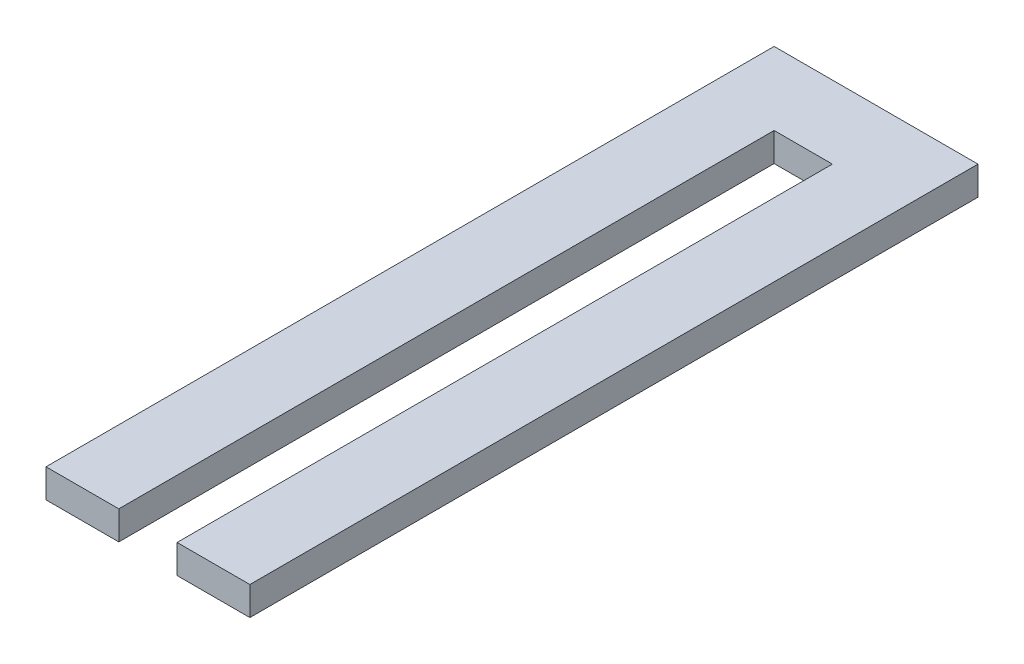
ISO-10303-21;
HEADER;
FILE_DESCRIPTION(('STEP AP214'),'2;1');
FILE_NAME('part.step','',(''),(''),'','','');
FILE_SCHEMA(('AUTOMOTIVE_DESIGN { 1 0 10303 214 1 1 1 1 }'));
ENDSEC;
DATA;
#1=APPLICATION_CONTEXT('core data for automotive mechanical design processes');
#2=APPLICATION_PROTOCOL_DEFINITION('international standard','automotive_design',2000,#1);
#3=PRODUCT_CONTEXT('',#1,'mechanical');
#4=PRODUCT('Part','Part','',(#3));
#5=PRODUCT_RELATED_PRODUCT_CATEGORY('part','',(#4));
#6=PRODUCT_DEFINITION_FORMATION('','',#4);
#7=PRODUCT_DEFINITION_CONTEXT('part definition',#1,'design');
#8=PRODUCT_DEFINITION('design','',#6,#7);
#9=PRODUCT_DEFINITION_SHAPE('','',#8);
#10=(LENGTH_UNIT() NAMED_UNIT(*) SI_UNIT(.MILLI.,.METRE.));
#11=(NAMED_UNIT(*) PLANE_ANGLE_UNIT() SI_UNIT($,.RADIAN.));
#12=(NAMED_UNIT(*) SI_UNIT($,.STERADIAN.) SOLID_ANGLE_UNIT());
#13=UNCERTAINTY_MEASURE_WITH_UNIT(LENGTH_MEASURE(1.E-05),#10,'distance_accuracy_value','');
#14=(GEOMETRIC_REPRESENTATION_CONTEXT(3) GLOBAL_UNCERTAINTY_ASSIGNED_CONTEXT((#13)) GLOBAL_UNIT_ASSIGNED_CONTEXT((#10,
#11,#12)) REPRESENTATION_CONTEXT('',''));
#15=CARTESIAN_POINT('',(0.,0.,0.));
#16=DIRECTION('',(0.,0.,1.));
#17=DIRECTION('',(1.,0.,0.));
#18=AXIS2_PLACEMENT_3D('',#15,#16,#17);
#19=CARTESIAN_POINT('',(-4.27789473684213,5.,114.3));
#20=DIRECTION('',(-1.,0.,0.));
#21=DIRECTION('',(0.,0.,1.));
#22=AXIS2_PLACEMENT_3D('',#19,#20,#21);
#23=PLANE('',#22);
#24=DIRECTION('',(0.,0.,-1.));
#25=VECTOR('',#24,1.);
#26=CARTESIAN_POINT('',(-4.27789473684213,0.,114.3));
#27=LINE('',#26,#25);
#28=CARTESIAN_POINT('',(-4.27789473684213,0.,114.3));
#29=VERTEX_POINT('',#28);
#30=CARTESIAN_POINT('',(-4.27789473684209,0.,0.));
#31=VERTEX_POINT('',#30);
#32=EDGE_CURVE('E140',#29,#31,#27,.T.);
#33=ORIENTED_EDGE('',*,*,#32,.T.);
#34=DIRECTION('',(0.,-1.,0.));
#35=VECTOR('',#34,1.);
#36=CARTESIAN_POINT('',(-4.27789473684209,5.,0.));
#37=LINE('',#36,#35);
#38=CARTESIAN_POINT('',(-4.27789473684209,5.,0.));
#39=VERTEX_POINT('',#38);
#40=EDGE_CURVE('E11',#39,#31,#37,.T.);
#41=ORIENTED_EDGE('',*,*,#40,.F.);
#42=DIRECTION('',(0.,0.,-1.));
#43=VECTOR('',#42,1.);
#44=CARTESIAN_POINT('',(-4.27789473684213,5.,114.3));
#45=LINE('',#44,#43);
#46=CARTESIAN_POINT('',(-4.27789473684213,5.,114.3));
#47=VERTEX_POINT('',#46);
#48=EDGE_CURVE('E162',#47,#39,#45,.T.);
#49=ORIENTED_EDGE('',*,*,#48,.F.);
#50=DIRECTION('',(0.,-1.,0.));
#51=VECTOR('',#50,1.);
#52=CARTESIAN_POINT('',(-4.27789473684213,5.,114.3));
#53=LINE('',#52,#51);
#54=EDGE_CURVE('E136',#47,#29,#53,.T.);
#55=ORIENTED_EDGE('',*,*,#54,.T.);
#56=EDGE_LOOP('',(#33,#41,#49,#55));
#57=FACE_BOUND('',#56,.T.);
#58=ADVANCED_FACE('F39',(#57),#23,.F.);
#59=CARTESIAN_POINT('',(-4.27789473684209,5.,0.));
#60=DIRECTION('',(0.,0.,-1.));
#61=DIRECTION('',(-1.,0.,0.));
#62=AXIS2_PLACEMENT_3D('',#59,#60,#61);
#63=PLANE('',#62);
#64=DIRECTION('',(1.,0.,0.));
#65=VECTOR('',#64,1.);
#66=CARTESIAN_POINT('',(-4.27789473684209,0.,0.));
#67=LINE('',#66,#65);
#68=CARTESIAN_POINT('',(5.88210526315791,0.,0.));
#69=VERTEX_POINT('',#68);
#70=EDGE_CURVE('E144',#31,#69,#67,.T.);
#71=ORIENTED_EDGE('',*,*,#70,.T.);
#72=DIRECTION('',(0.,-1.,0.));
#73=VECTOR('',#72,1.);
#74=CARTESIAN_POINT('',(5.88210526315791,5.,0.));
#75=LINE('',#74,#73);
#76=CARTESIAN_POINT('',(5.88210526315791,5.,0.));
#77=VERTEX_POINT('',#76);
#78=EDGE_CURVE('E48',#77,#69,#75,.T.);
#79=ORIENTED_EDGE('',*,*,#78,.F.);
#80=DIRECTION('',(1.,0.,0.));
#81=VECTOR('',#80,1.);
#82=CARTESIAN_POINT('',(-4.27789473684209,5.,0.));
#83=LINE('',#82,#81);
#84=EDGE_CURVE('E99',#39,#77,#83,.T.);
#85=ORIENTED_EDGE('',*,*,#84,.F.);
#86=ORIENTED_EDGE('',*,*,#40,.T.);
#87=EDGE_LOOP('',(#71,#79,#85,#86));
#88=FACE_BOUND('',#87,.T.);
#89=ADVANCED_FACE('F208',(#88),#63,.F.);
#90=CARTESIAN_POINT('',(5.88210526315791,5.,0.));
#91=DIRECTION('',(1.,0.,0.));
#92=DIRECTION('',(0.,0.,-1.));
#93=AXIS2_PLACEMENT_3D('',#90,#91,#92);
#94=PLANE('',#93);
#95=DIRECTION('',(0.,0.,1.));
#96=VECTOR('',#95,1.);
#97=CARTESIAN_POINT('',(5.88210526315791,0.,0.));
#98=LINE('',#97,#96);
#99=CARTESIAN_POINT('',(5.88210526315788,0.,114.3));
#100=VERTEX_POINT('',#99);
#101=EDGE_CURVE('E147',#69,#100,#98,.T.);
#102=ORIENTED_EDGE('',*,*,#101,.T.);
#103=DIRECTION('',(0.,-1.,0.));
#104=VECTOR('',#103,1.);
#105=CARTESIAN_POINT('',(5.88210526315788,5.,114.3));
#106=LINE('',#105,#104);
#107=CARTESIAN_POINT('',(5.88210526315788,5.,114.3));
#108=VERTEX_POINT('',#107);
#109=EDGE_CURVE('E173',#108,#100,#106,.T.);
#110=ORIENTED_EDGE('',*,*,#109,.F.);
#111=DIRECTION('',(0.,0.,1.));
#112=VECTOR('',#111,1.);
#113=CARTESIAN_POINT('',(5.88210526315791,5.,0.));
#114=LINE('',#113,#112);
#115=EDGE_CURVE('E183',#77,#108,#114,.T.);
#116=ORIENTED_EDGE('',*,*,#115,.F.);
#117=ORIENTED_EDGE('',*,*,#78,.T.);
#118=EDGE_LOOP('',(#102,#110,#116,#117));
#119=FACE_BOUND('',#118,.T.);
#120=ADVANCED_FACE('F181',(#119),#94,.F.);
#121=CARTESIAN_POINT('',(5.88210526315788,5.,114.3));
#122=DIRECTION('',(0.,0.,-1.));
#123=DIRECTION('',(-1.,0.,0.));
#124=AXIS2_PLACEMENT_3D('',#121,#122,#123);
#125=PLANE('',#124);
#126=DIRECTION('',(1.,0.,0.));
#127=VECTOR('',#126,1.);
#128=CARTESIAN_POINT('',(5.88210526315788,0.,114.3));
#129=LINE('',#128,#127);
#130=CARTESIAN_POINT('',(18.5821052631579,0.,114.3));
#131=VERTEX_POINT('',#130);
#132=EDGE_CURVE('E150',#100,#131,#129,.T.);
#133=ORIENTED_EDGE('',*,*,#132,.T.);
#134=DIRECTION('',(0.,-1.,0.));
#135=VECTOR('',#134,1.);
#136=CARTESIAN_POINT('',(18.5821052631579,5.,114.3));
#137=LINE('',#136,#135);
#138=CARTESIAN_POINT('',(18.5821052631579,5.,114.3));
#139=VERTEX_POINT('',#138);
#140=EDGE_CURVE('E169',#139,#131,#137,.T.);
#141=ORIENTED_EDGE('',*,*,#140,.F.);
#142=DIRECTION('',(1.,0.,0.));
#143=VECTOR('',#142,1.);
#144=CARTESIAN_POINT('',(5.88210526315788,5.,114.3));
#145=LINE('',#144,#143);
#146=EDGE_CURVE('E196',#108,#139,#145,.T.);
#147=ORIENTED_EDGE('',*,*,#146,.F.);
#148=ORIENTED_EDGE('',*,*,#109,.T.);
#149=EDGE_LOOP('',(#133,#141,#147,#148));
#150=FACE_BOUND('',#149,.T.);
#151=ADVANCED_FACE('F191',(#150),#125,.F.);
#152=CARTESIAN_POINT('',(18.5821052631579,5.,114.3));
#153=DIRECTION('',(-1.,0.,0.));
#154=DIRECTION('',(0.,0.,1.));
#155=AXIS2_PLACEMENT_3D('',#152,#153,#154);
#156=PLANE('',#155);
#157=DIRECTION('',(0.,0.,-1.));
#158=VECTOR('',#157,1.);
#159=CARTESIAN_POINT('',(18.5821052631579,0.,114.3));
#160=LINE('',#159,#158);
#161=CARTESIAN_POINT('',(18.5821052631579,0.,-12.7));
#162=VERTEX_POINT('',#161);
#163=EDGE_CURVE('E153',#131,#162,#160,.T.);
#164=ORIENTED_EDGE('',*,*,#163,.T.);
#165=DIRECTION('',(0.,-1.,0.));
#166=VECTOR('',#165,1.);
#167=CARTESIAN_POINT('',(18.5821052631579,5.,-12.7));
#168=LINE('',#167,#166);
#169=CARTESIAN_POINT('',(18.5821052631579,5.,-12.7));
#170=VERTEX_POINT('',#169);
#171=EDGE_CURVE('E129',#170,#162,#168,.T.);
#172=ORIENTED_EDGE('',*,*,#171,.F.);
#173=DIRECTION('',(0.,0.,-1.));
#174=VECTOR('',#173,1.);
#175=CARTESIAN_POINT('',(18.5821052631579,5.,114.3));
#176=LINE('',#175,#174);
#177=EDGE_CURVE('E118',#139,#170,#176,.T.);
#178=ORIENTED_EDGE('',*,*,#177,.F.);
#179=ORIENTED_EDGE('',*,*,#140,.T.);
#180=EDGE_LOOP('',(#164,#172,#178,#179));
#181=FACE_BOUND('',#180,.T.);
#182=ADVANCED_FACE('F194',(#181),#156,.F.);
#183=CARTESIAN_POINT('',(18.5821052631579,5.,-12.7));
#184=DIRECTION('',(0.,0.,1.));
#185=DIRECTION('',(1.,0.,0.));
#186=AXIS2_PLACEMENT_3D('',#183,#184,#185);
#187=PLANE('',#186);
#188=DIRECTION('',(-1.,0.,0.));
#189=VECTOR('',#188,1.);
#190=CARTESIAN_POINT('',(18.5821052631579,0.,-12.7));
#191=LINE('',#190,#189);
#192=CARTESIAN_POINT('',(-16.9778947368421,0.,-12.7));
#193=VERTEX_POINT('',#192);
#194=EDGE_CURVE('E127',#162,#193,#191,.T.);
#195=ORIENTED_EDGE('',*,*,#194,.T.);
#196=DIRECTION('',(0.,-1.,0.));
#197=VECTOR('',#196,1.);
#198=CARTESIAN_POINT('',(-16.9778947368421,5.,-12.7));
#199=LINE('',#198,#197);
#200=CARTESIAN_POINT('',(-16.9778947368421,5.,-12.7));
#201=VERTEX_POINT('',#200);
#202=EDGE_CURVE('E124',#201,#193,#199,.T.);
#203=ORIENTED_EDGE('',*,*,#202,.F.);
#204=DIRECTION('',(-1.,0.,0.));
#205=VECTOR('',#204,1.);
#206=CARTESIAN_POINT('',(18.5821052631579,5.,-12.7));
#207=LINE('',#206,#205);
#208=EDGE_CURVE('E112',#170,#201,#207,.T.);
#209=ORIENTED_EDGE('',*,*,#208,.F.);
#210=ORIENTED_EDGE('',*,*,#171,.T.);
#211=EDGE_LOOP('',(#195,#203,#209,#210));
#212=FACE_BOUND('',#211,.T.);
#213=ADVANCED_FACE('F125',(#212),#187,.F.);
#214=CARTESIAN_POINT('',(-16.9778947368421,5.,-12.7));
#215=DIRECTION('',(1.,0.,0.));
#216=DIRECTION('',(0.,0.,-1.));
#217=AXIS2_PLACEMENT_3D('',#214,#215,#216);
#218=PLANE('',#217);
#219=DIRECTION('',(0.,0.,1.));
#220=VECTOR('',#219,1.);
#221=CARTESIAN_POINT('',(-16.9778947368421,0.,-12.7));
#222=LINE('',#221,#220);
#223=CARTESIAN_POINT('',(-16.9778947368421,0.,114.3));
#224=VERTEX_POINT('',#223);
#225=EDGE_CURVE('E85',#193,#224,#222,.T.);
#226=ORIENTED_EDGE('',*,*,#225,.T.);
#227=DIRECTION('',(0.,-1.,0.));
#228=VECTOR('',#227,1.);
#229=CARTESIAN_POINT('',(-16.9778947368421,5.,114.3));
#230=LINE('',#229,#228);
#231=CARTESIAN_POINT('',(-16.9778947368421,5.,114.3));
#232=VERTEX_POINT('',#231);
#233=EDGE_CURVE('E130',#232,#224,#230,.T.);
#234=ORIENTED_EDGE('',*,*,#233,.F.);
#235=DIRECTION('',(0.,0.,1.));
#236=VECTOR('',#235,1.);
#237=CARTESIAN_POINT('',(-16.9778947368421,5.,-12.7));
#238=LINE('',#237,#236);
#239=EDGE_CURVE('E116',#201,#232,#238,.T.);
#240=ORIENTED_EDGE('',*,*,#239,.F.);
#241=ORIENTED_EDGE('',*,*,#202,.T.);
#242=EDGE_LOOP('',(#226,#234,#240,#241));
#243=FACE_BOUND('',#242,.T.);
#244=ADVANCED_FACE('F132',(#243),#218,.F.);
#245=CARTESIAN_POINT('',(-16.9778947368421,5.,114.3));
#246=DIRECTION('',(0.,0.,-1.));
#247=DIRECTION('',(-1.,0.,0.));
#248=AXIS2_PLACEMENT_3D('',#245,#246,#247);
#249=PLANE('',#248);
#250=DIRECTION('',(1.,0.,0.));
#251=VECTOR('',#250,1.);
#252=CARTESIAN_POINT('',(-16.9778947368421,0.,114.3));
#253=LINE('',#252,#251);
#254=EDGE_CURVE('E91',#224,#29,#253,.T.);
#255=ORIENTED_EDGE('',*,*,#254,.T.);
#256=ORIENTED_EDGE('',*,*,#54,.F.);
#257=DIRECTION('',(1.,0.,0.));
#258=VECTOR('',#257,1.);
#259=CARTESIAN_POINT('',(-16.9778947368421,5.,114.3));
#260=LINE('',#259,#258);
#261=EDGE_CURVE('E56',#232,#47,#260,.T.);
#262=ORIENTED_EDGE('',*,*,#261,.F.);
#263=ORIENTED_EDGE('',*,*,#233,.T.);
#264=EDGE_LOOP('',(#255,#256,#262,#263));
#265=FACE_BOUND('',#264,.T.);
#266=ADVANCED_FACE('F224',(#265),#249,.F.);
#267=CARTESIAN_POINT('',(0.,5.,0.));
#268=DIRECTION('',(0.,-1.,0.));
#269=DIRECTION('',(0.,0.,-1.));
#270=AXIS2_PLACEMENT_3D('',#267,#268,#269);
#271=PLANE('',#270);
#272=ORIENTED_EDGE('',*,*,#48,.T.);
#273=ORIENTED_EDGE('',*,*,#84,.T.);
#274=ORIENTED_EDGE('',*,*,#115,.T.);
#275=ORIENTED_EDGE('',*,*,#146,.T.);
#276=ORIENTED_EDGE('',*,*,#177,.T.);
#277=ORIENTED_EDGE('',*,*,#208,.T.);
#278=ORIENTED_EDGE('',*,*,#239,.T.);
#279=ORIENTED_EDGE('',*,*,#261,.T.);
#280=EDGE_LOOP('',(#272,#273,#274,#275,#276,#277,#278,#279));
#281=FACE_BOUND('',#280,.T.);
#282=ADVANCED_FACE('F114',(#281),#271,.F.);
#283=CARTESIAN_POINT('',(0.,0.,0.));
#284=DIRECTION('',(0.,-1.,0.));
#285=DIRECTION('',(0.,0.,-1.));
#286=AXIS2_PLACEMENT_3D('',#283,#284,#285);
#287=PLANE('',#286);
#288=ORIENTED_EDGE('',*,*,#32,.F.);
#289=ORIENTED_EDGE('',*,*,#254,.F.);
#290=ORIENTED_EDGE('',*,*,#225,.F.);
#291=ORIENTED_EDGE('',*,*,#194,.F.);
#292=ORIENTED_EDGE('',*,*,#163,.F.);
#293=ORIENTED_EDGE('',*,*,#132,.F.);
#294=ORIENTED_EDGE('',*,*,#101,.F.);
#295=ORIENTED_EDGE('',*,*,#70,.F.);
#296=EDGE_LOOP('',(#288,#289,#290,#291,#292,#293,#294,#295));
#297=FACE_BOUND('',#296,.T.);
#298=ADVANCED_FACE('F187',(#297),#287,.T.);
#299=CLOSED_SHELL('',(#58,#89,#120,#151,#182,#213,#244,#266,#282,#298));
#300=MANIFOLD_SOLID_BREP('B2',#299);
#301=ADVANCED_BREP_SHAPE_REPRESENTATION('',(#18,#300),#14);
#302=SHAPE_DEFINITION_REPRESENTATION(#9,#301);
ENDSEC;
END-ISO-10303-21;
